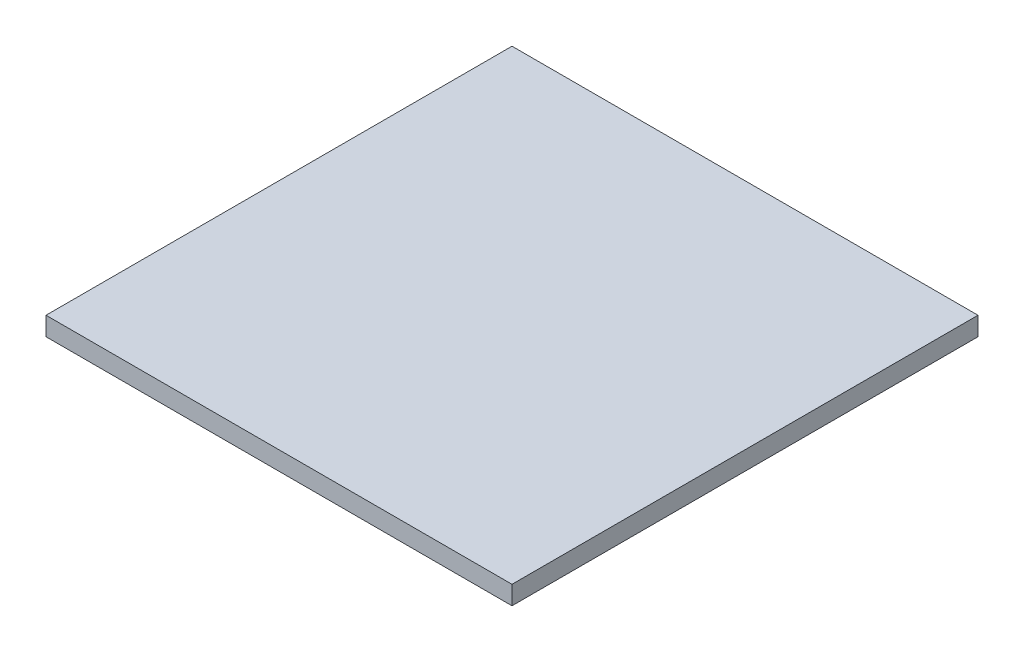
ISO-10303-21;
HEADER;
FILE_DESCRIPTION(('STEP AP214'),'2;1');
FILE_NAME('part.step','',(''),(''),'','','');
FILE_SCHEMA(('AUTOMOTIVE_DESIGN { 1 0 10303 214 1 1 1 1 }'));
ENDSEC;
DATA;
#1=APPLICATION_CONTEXT('core data for automotive mechanical design processes');
#2=APPLICATION_PROTOCOL_DEFINITION('international standard','automotive_design',2000,#1);
#3=PRODUCT_CONTEXT('',#1,'mechanical');
#4=PRODUCT('Part','Part','',(#3));
#5=PRODUCT_RELATED_PRODUCT_CATEGORY('part','',(#4));
#6=PRODUCT_DEFINITION_FORMATION('','',#4);
#7=PRODUCT_DEFINITION_CONTEXT('part definition',#1,'design');
#8=PRODUCT_DEFINITION('design','',#6,#7);
#9=PRODUCT_DEFINITION_SHAPE('','',#8);
#10=(LENGTH_UNIT() NAMED_UNIT(*) SI_UNIT(.MILLI.,.METRE.));
#11=(NAMED_UNIT(*) PLANE_ANGLE_UNIT() SI_UNIT($,.RADIAN.));
#12=(NAMED_UNIT(*) SI_UNIT($,.STERADIAN.) SOLID_ANGLE_UNIT());
#13=UNCERTAINTY_MEASURE_WITH_UNIT(LENGTH_MEASURE(1.E-05),#10,'distance_accuracy_value','');
#14=(GEOMETRIC_REPRESENTATION_CONTEXT(3) GLOBAL_UNCERTAINTY_ASSIGNED_CONTEXT((#13)) GLOBAL_UNIT_ASSIGNED_CONTEXT((#10,
#11,#12)) REPRESENTATION_CONTEXT('',''));
#15=CARTESIAN_POINT('',(0.,0.,0.));
#16=DIRECTION('',(0.,0.,1.));
#17=DIRECTION('',(1.,0.,0.));
#18=AXIS2_PLACEMENT_3D('',#15,#16,#17);
#19=CARTESIAN_POINT('',(250.,20.,250.));
#20=DIRECTION('',(-1.,0.,0.));
#21=DIRECTION('',(0.,0.,1.));
#22=AXIS2_PLACEMENT_3D('',#19,#20,#21);
#23=PLANE('',#22);
#24=DIRECTION('',(0.,0.,-1.));
#25=VECTOR('',#24,1.);
#26=CARTESIAN_POINT('',(250.,0.,250.));
#27=LINE('',#26,#25);
#28=CARTESIAN_POINT('',(250.,0.,250.));
#29=VERTEX_POINT('',#28);
#30=CARTESIAN_POINT('',(250.,0.,-250.));
#31=VERTEX_POINT('',#30);
#32=EDGE_CURVE('E100',#29,#31,#27,.T.);
#33=ORIENTED_EDGE('',*,*,#32,.T.);
#34=DIRECTION('',(0.,-1.,0.));
#35=VECTOR('',#34,1.);
#36=CARTESIAN_POINT('',(250.,20.,-250.));
#37=LINE('',#36,#35);
#38=CARTESIAN_POINT('',(250.,20.,-250.));
#39=VERTEX_POINT('',#38);
#40=EDGE_CURVE('E11',#39,#31,#37,.T.);
#41=ORIENTED_EDGE('',*,*,#40,.F.);
#42=DIRECTION('',(0.,0.,-1.));
#43=VECTOR('',#42,1.);
#44=CARTESIAN_POINT('',(250.,20.,250.));
#45=LINE('',#44,#43);
#46=CARTESIAN_POINT('',(250.,20.,250.));
#47=VERTEX_POINT('',#46);
#48=EDGE_CURVE('E88',#47,#39,#45,.T.);
#49=ORIENTED_EDGE('',*,*,#48,.F.);
#50=DIRECTION('',(0.,-1.,0.));
#51=VECTOR('',#50,1.);
#52=CARTESIAN_POINT('',(250.,20.,250.));
#53=LINE('',#52,#51);
#54=EDGE_CURVE('E96',#47,#29,#53,.T.);
#55=ORIENTED_EDGE('',*,*,#54,.T.);
#56=EDGE_LOOP('',(#33,#41,#49,#55));
#57=FACE_BOUND('',#56,.T.);
#58=ADVANCED_FACE('F37',(#57),#23,.F.);
#59=CARTESIAN_POINT('',(-250.,20.,-250.));
#60=DIRECTION('',(0.,0.,1.));
#61=DIRECTION('',(1.,0.,0.));
#62=AXIS2_PLACEMENT_3D('',#59,#60,#61);
#63=PLANE('',#62);
#64=DIRECTION('',(-1.,0.,0.));
#65=VECTOR('',#64,1.);
#66=CARTESIAN_POINT('',(-250.,0.,-250.));
#67=LINE('',#66,#65);
#68=CARTESIAN_POINT('',(-250.,0.,-250.));
#69=VERTEX_POINT('',#68);
#70=EDGE_CURVE('E92',#31,#69,#67,.T.);
#71=ORIENTED_EDGE('',*,*,#70,.T.);
#72=DIRECTION('',(0.,-1.,0.));
#73=VECTOR('',#72,1.);
#74=CARTESIAN_POINT('',(-250.,20.,-250.));
#75=LINE('',#74,#73);
#76=CARTESIAN_POINT('',(-250.,20.,-250.));
#77=VERTEX_POINT('',#76);
#78=EDGE_CURVE('E45',#77,#69,#75,.T.);
#79=ORIENTED_EDGE('',*,*,#78,.F.);
#80=DIRECTION('',(-1.,0.,0.));
#81=VECTOR('',#80,1.);
#82=CARTESIAN_POINT('',(-250.,20.,-250.));
#83=LINE('',#82,#81);
#84=EDGE_CURVE('E83',#39,#77,#83,.T.);
#85=ORIENTED_EDGE('',*,*,#84,.F.);
#86=ORIENTED_EDGE('',*,*,#40,.T.);
#87=EDGE_LOOP('',(#71,#79,#85,#86));
#88=FACE_BOUND('',#87,.T.);
#89=ADVANCED_FACE('F91',(#88),#63,.F.);
#90=CARTESIAN_POINT('',(-250.,20.,250.));
#91=DIRECTION('',(1.,0.,0.));
#92=DIRECTION('',(0.,0.,-1.));
#93=AXIS2_PLACEMENT_3D('',#90,#91,#92);
#94=PLANE('',#93);
#95=DIRECTION('',(0.,0.,1.));
#96=VECTOR('',#95,1.);
#97=CARTESIAN_POINT('',(-250.,0.,250.));
#98=LINE('',#97,#96);
#99=CARTESIAN_POINT('',(-250.,0.,250.));
#100=VERTEX_POINT('',#99);
#101=EDGE_CURVE('E70',#69,#100,#98,.T.);
#102=ORIENTED_EDGE('',*,*,#101,.T.);
#103=DIRECTION('',(0.,-1.,0.));
#104=VECTOR('',#103,1.);
#105=CARTESIAN_POINT('',(-250.,20.,250.));
#106=LINE('',#105,#104);
#107=CARTESIAN_POINT('',(-250.,20.,250.));
#108=VERTEX_POINT('',#107);
#109=EDGE_CURVE('E93',#108,#100,#106,.T.);
#110=ORIENTED_EDGE('',*,*,#109,.F.);
#111=DIRECTION('',(0.,0.,1.));
#112=VECTOR('',#111,1.);
#113=CARTESIAN_POINT('',(-250.,20.,250.));
#114=LINE('',#113,#112);
#115=EDGE_CURVE('E86',#77,#108,#114,.T.);
#116=ORIENTED_EDGE('',*,*,#115,.F.);
#117=ORIENTED_EDGE('',*,*,#78,.T.);
#118=EDGE_LOOP('',(#102,#110,#116,#117));
#119=FACE_BOUND('',#118,.T.);
#120=ADVANCED_FACE('F94',(#119),#94,.F.);
#121=CARTESIAN_POINT('',(-250.,20.,250.));
#122=DIRECTION('',(0.,0.,-1.));
#123=DIRECTION('',(-1.,0.,0.));
#124=AXIS2_PLACEMENT_3D('',#121,#122,#123);
#125=PLANE('',#124);
#126=DIRECTION('',(1.,0.,0.));
#127=VECTOR('',#126,1.);
#128=CARTESIAN_POINT('',(-250.,0.,250.));
#129=LINE('',#128,#127);
#130=EDGE_CURVE('E76',#100,#29,#129,.T.);
#131=ORIENTED_EDGE('',*,*,#130,.T.);
#132=ORIENTED_EDGE('',*,*,#54,.F.);
#133=DIRECTION('',(1.,0.,0.));
#134=VECTOR('',#133,1.);
#135=CARTESIAN_POINT('',(-250.,20.,250.));
#136=LINE('',#135,#134);
#137=EDGE_CURVE('E53',#108,#47,#136,.T.);
#138=ORIENTED_EDGE('',*,*,#137,.F.);
#139=ORIENTED_EDGE('',*,*,#109,.T.);
#140=EDGE_LOOP('',(#131,#132,#138,#139));
#141=FACE_BOUND('',#140,.T.);
#142=ADVANCED_FACE('F107',(#141),#125,.F.);
#143=CARTESIAN_POINT('',(0.,20.,0.));
#144=DIRECTION('',(0.,-1.,0.));
#145=DIRECTION('',(0.,0.,-1.));
#146=AXIS2_PLACEMENT_3D('',#143,#144,#145);
#147=PLANE('',#146);
#148=ORIENTED_EDGE('',*,*,#48,.T.);
#149=ORIENTED_EDGE('',*,*,#84,.T.);
#150=ORIENTED_EDGE('',*,*,#115,.T.);
#151=ORIENTED_EDGE('',*,*,#137,.T.);
#152=EDGE_LOOP('',(#148,#149,#150,#151));
#153=FACE_BOUND('',#152,.T.);
#154=ADVANCED_FACE('F84',(#153),#147,.F.);
#155=CARTESIAN_POINT('',(0.,0.,0.));
#156=DIRECTION('',(0.,-1.,0.));
#157=DIRECTION('',(0.,0.,-1.));
#158=AXIS2_PLACEMENT_3D('',#155,#156,#157);
#159=PLANE('',#158);
#160=ORIENTED_EDGE('',*,*,#32,.F.);
#161=ORIENTED_EDGE('',*,*,#130,.F.);
#162=ORIENTED_EDGE('',*,*,#101,.F.);
#163=ORIENTED_EDGE('',*,*,#70,.F.);
#164=EDGE_LOOP('',(#160,#161,#162,#163));
#165=FACE_BOUND('',#164,.T.);
#166=ADVANCED_FACE('F110',(#165),#159,.T.);
#167=CLOSED_SHELL('',(#58,#89,#120,#142,#154,#166));
#168=MANIFOLD_SOLID_BREP('B2',#167);
#169=ADVANCED_BREP_SHAPE_REPRESENTATION('',(#18,#168),#14);
#170=SHAPE_DEFINITION_REPRESENTATION(#9,#169);
ENDSEC;
END-ISO-10303-21;
